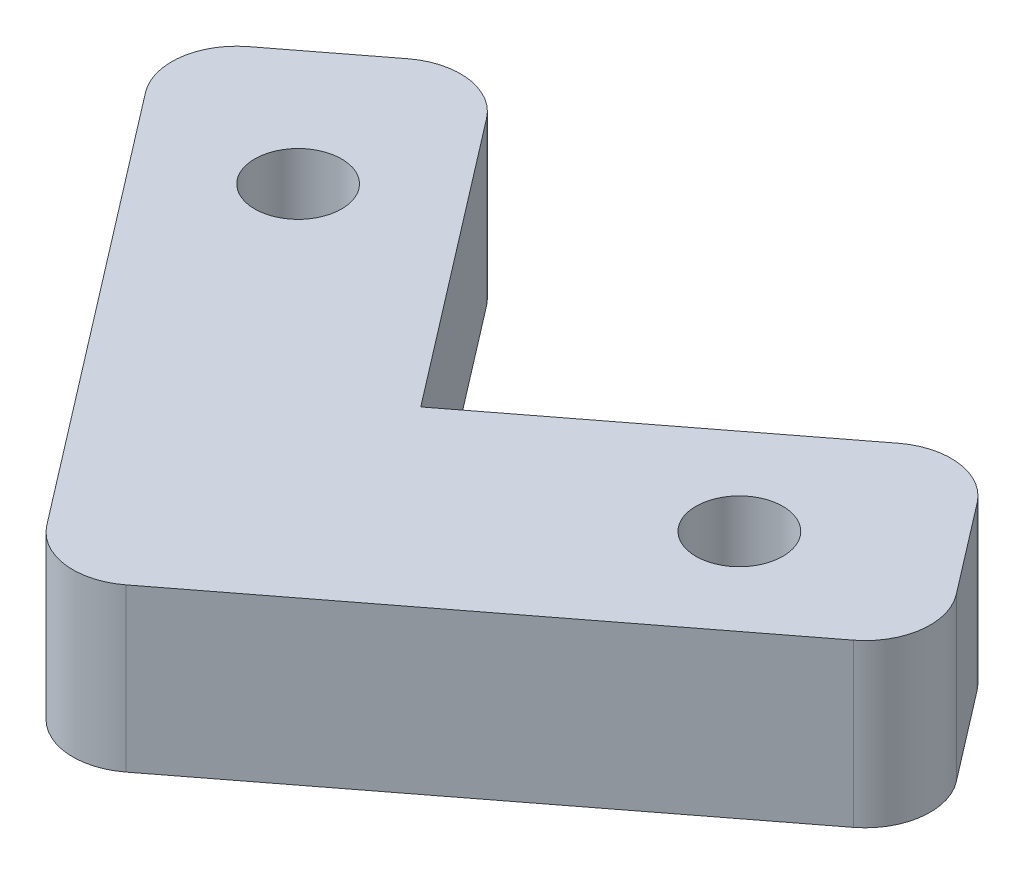
ISO-10303-21;
HEADER;
FILE_DESCRIPTION(('STEP AP214'),'2;1');
FILE_NAME('part.step','',(''),(''),'','','');
FILE_SCHEMA(('AUTOMOTIVE_DESIGN { 1 0 10303 214 1 1 1 1 }'));
ENDSEC;
DATA;
#1=APPLICATION_CONTEXT('core data for automotive mechanical design processes');
#2=APPLICATION_PROTOCOL_DEFINITION('international standard','automotive_design',2000,#1);
#3=PRODUCT_CONTEXT('',#1,'mechanical');
#4=PRODUCT('Part','Part','',(#3));
#5=PRODUCT_RELATED_PRODUCT_CATEGORY('part','',(#4));
#6=PRODUCT_DEFINITION_FORMATION('','',#4);
#7=PRODUCT_DEFINITION_CONTEXT('part definition',#1,'design');
#8=PRODUCT_DEFINITION('design','',#6,#7);
#9=PRODUCT_DEFINITION_SHAPE('','',#8);
#10=(LENGTH_UNIT() NAMED_UNIT(*) SI_UNIT(.MILLI.,.METRE.));
#11=(NAMED_UNIT(*) PLANE_ANGLE_UNIT() SI_UNIT($,.RADIAN.));
#12=(NAMED_UNIT(*) SI_UNIT($,.STERADIAN.) SOLID_ANGLE_UNIT());
#13=UNCERTAINTY_MEASURE_WITH_UNIT(LENGTH_MEASURE(1.E-05),#10,'distance_accuracy_value','');
#14=(GEOMETRIC_REPRESENTATION_CONTEXT(3) GLOBAL_UNCERTAINTY_ASSIGNED_CONTEXT((#13)) GLOBAL_UNIT_ASSIGNED_CONTEXT((#10,
#11,#12)) REPRESENTATION_CONTEXT('',''));
#15=CARTESIAN_POINT('',(0.,0.,0.));
#16=DIRECTION('',(0.,0.,1.));
#17=DIRECTION('',(1.,0.,0.));
#18=AXIS2_PLACEMENT_3D('',#15,#16,#17);
#19=CARTESIAN_POINT('',(0.,6.35,0.));
#20=DIRECTION('',(0.,1.,0.));
#21=DIRECTION('',(0.,0.,1.));
#22=AXIS2_PLACEMENT_3D('',#19,#20,#21);
#23=PLANE('',#22);
#24=CARTESIAN_POINT('',(117.248460029199,6.35,95.9258461633713));
#25=DIRECTION('',(0.,1.,0.));
#26=DIRECTION('',(0.,0.,1.));
#27=AXIS2_PLACEMENT_3D('',#24,#25,#26);
#28=CIRCLE('',#27,1.70053000000001);
#29=CARTESIAN_POINT('',(117.248460029199,6.35,97.6263761633713));
#30=VERTEX_POINT('',#29);
#31=EDGE_CURVE('E214',#30,#30,#28,.T.);
#32=ORIENTED_EDGE('',*,*,#31,.F.);
#33=EDGE_LOOP('',(#32));
#34=FACE_BOUND('',#33,.T.);
#35=DIRECTION('',(-0.608761429008718,0.,-0.793353340291237));
#36=VECTOR('',#35,1.);
#37=CARTESIAN_POINT('',(145.604758319495,6.35,98.9796926758365));
#38=LINE('',#37,#36);
#39=CARTESIAN_POINT('',(144.058504289813,6.35,96.9645751914968));
#40=VERTEX_POINT('',#39);
#41=CARTESIAN_POINT('',(141.352559737869,6.35,93.4381195939021));
#42=VERTEX_POINT('',#41);
#43=EDGE_CURVE('E145',#40,#42,#38,.T.);
#44=ORIENTED_EDGE('',*,*,#43,.T.);
#45=CARTESIAN_POINT('',(139.33744225353,6.35,94.9843736235843));
#46=DIRECTION('',(0.,1.,0.));
#47=DIRECTION('',(0.,0.,1.));
#48=AXIS2_PLACEMENT_3D('',#45,#46,#47);
#49=CIRCLE('',#48,2.54);
#50=CARTESIAN_POINT('',(137.791188223847,6.35,92.9692561392445));
#51=VERTEX_POINT('',#50);
#52=EDGE_CURVE('E124',#42,#51,#49,.T.);
#53=ORIENTED_EDGE('',*,*,#52,.T.);
#54=DIRECTION('',(-0.793353340291261,0.,0.608761429008687));
#55=VECTOR('',#54,1.);
#56=CARTESIAN_POINT('',(139.806305708187,6.35,91.4230021095625));
#57=LINE('',#56,#55);
#58=CARTESIAN_POINT('',(127.211821431064,6.35,101.087089795075));
#59=VERTEX_POINT('',#58);
#60=EDGE_CURVE('E117',#51,#59,#57,.T.);
#61=ORIENTED_EDGE('',*,*,#60,.T.);
#62=DIRECTION('',(-0.608761429008724,0.,-0.793353340291233));
#63=VECTOR('',#62,1.);
#64=CARTESIAN_POINT('',(117.16117023813,6.35,87.9888261468679));
#65=LINE('',#64,#63);
#66=CARTESIAN_POINT('',(118.707424267812,6.35,90.0039436312077));
#67=VERTEX_POINT('',#66);
#68=EDGE_CURVE('E121',#59,#67,#65,.T.);
#69=ORIENTED_EDGE('',*,*,#68,.T.);
#70=CARTESIAN_POINT('',(116.692306783473,6.35,91.5501976608898));
#71=DIRECTION('',(0.,1.,0.));
#72=DIRECTION('',(0.,0.,1.));
#73=AXIS2_PLACEMENT_3D('',#70,#71,#72);
#74=CIRCLE('',#73,2.54);
#75=CARTESIAN_POINT('',(115.14605275379,6.35,89.5350801765501));
#76=VERTEX_POINT('',#75);
#77=EDGE_CURVE('E173',#67,#76,#74,.T.);
#78=ORIENTED_EDGE('',*,*,#77,.T.);
#79=DIRECTION('',(-0.793353340291239,0.,0.608761429008716));
#80=VECTOR('',#79,1.);
#81=CARTESIAN_POINT('',(109.604479671856,6.35,93.787278758176));
#82=LINE('',#81,#80);
#83=CARTESIAN_POINT('',(111.619597156196,6.35,92.2410247284938));
#84=VERTEX_POINT('',#83);
#85=EDGE_CURVE('E138',#76,#84,#82,.T.);
#86=ORIENTED_EDGE('',*,*,#85,.T.);
#87=CARTESIAN_POINT('',(113.165851185878,6.35,94.2561422128336));
#88=DIRECTION('',(0.,1.,0.));
#89=DIRECTION('',(0.,0.,1.));
#90=AXIS2_PLACEMENT_3D('',#87,#88,#89);
#91=CIRCLE('',#90,2.54);
#92=CARTESIAN_POINT('',(111.150733701538,6.35,95.8023962425157));
#93=VERTEX_POINT('',#92);
#94=EDGE_CURVE('E169',#84,#93,#91,.T.);
#95=ORIENTED_EDGE('',*,*,#94,.T.);
#96=DIRECTION('',(0.608761429008717,0.,0.793353340291238));
#97=VECTOR('',#96,1.);
#98=CARTESIAN_POINT('',(125.453583476098,6.35,114.442232972658));
#99=LINE('',#98,#97);
#100=CARTESIAN_POINT('',(123.907329446416,6.35,112.427115488318));
#101=VERTEX_POINT('',#100);
#102=EDGE_CURVE('E190',#93,#101,#99,.T.);
#103=ORIENTED_EDGE('',*,*,#102,.T.);
#104=CARTESIAN_POINT('',(125.922446930755,6.35,110.880861458636));
#105=DIRECTION('',(0.,1.,0.));
#106=DIRECTION('',(0.,0.,1.));
#107=AXIS2_PLACEMENT_3D('',#104,#105,#106);
#108=CIRCLE('',#107,2.54);
#109=CARTESIAN_POINT('',(127.468700960438,6.35,112.895978942976));
#110=VERTEX_POINT('',#109);
#111=EDGE_CURVE('E55',#101,#110,#108,.T.);
#112=ORIENTED_EDGE('',*,*,#111,.T.);
#113=DIRECTION('',(0.793353340291238,0.,-0.608761429008717));
#114=VECTOR('',#113,1.);
#115=CARTESIAN_POINT('',(125.453583476098,6.35,114.442232972658));
#116=LINE('',#115,#114);
#117=CARTESIAN_POINT('',(143.589640835155,6.35,100.525946705519));
#118=VERTEX_POINT('',#117);
#119=EDGE_CURVE('E149',#110,#118,#116,.T.);
#120=ORIENTED_EDGE('',*,*,#119,.T.);
#121=CARTESIAN_POINT('',(142.043386805473,6.35,98.5108292211789));
#122=DIRECTION('',(0.,1.,0.));
#123=DIRECTION('',(0.,0.,1.));
#124=AXIS2_PLACEMENT_3D('',#121,#122,#123);
#125=CIRCLE('',#124,2.54);
#126=EDGE_CURVE('E171',#118,#40,#125,.T.);
#127=ORIENTED_EDGE('',*,*,#126,.T.);
#128=EDGE_LOOP('',(#44,#53,#61,#69,#78,#86,#95,#103,#112,#120,#127));
#129=FACE_BOUND('',#128,.T.);
#130=CARTESIAN_POINT('',(137.667738302992,6.35,99.0669824669048));
#131=DIRECTION('',(0.,1.,0.));
#132=DIRECTION('',(0.,0.,1.));
#133=AXIS2_PLACEMENT_3D('',#130,#131,#132);
#134=CIRCLE('',#133,1.70052999999999);
#135=CARTESIAN_POINT('',(137.667738302992,6.35,100.767512466905));
#136=VERTEX_POINT('',#135);
#137=EDGE_CURVE('E221',#136,#136,#134,.T.);
#138=ORIENTED_EDGE('',*,*,#137,.F.);
#139=EDGE_LOOP('',(#138));
#140=FACE_BOUND('',#139,.T.);
#141=ADVANCED_FACE('F33',(#34,#129,#140),#23,.T.);
#142=CARTESIAN_POINT('',(0.,0.,0.));
#143=DIRECTION('',(0.,1.,0.));
#144=DIRECTION('',(0.,0.,1.));
#145=AXIS2_PLACEMENT_3D('',#142,#143,#144);
#146=PLANE('',#145);
#147=CARTESIAN_POINT('',(117.248460029199,0.,95.9258461633713));
#148=DIRECTION('',(0.,1.,0.));
#149=DIRECTION('',(0.,0.,1.));
#150=AXIS2_PLACEMENT_3D('',#147,#148,#149);
#151=CIRCLE('',#150,1.70053000000001);
#152=CARTESIAN_POINT('',(117.248460029199,0.,97.6263761633713));
#153=VERTEX_POINT('',#152);
#154=EDGE_CURVE('E218',#153,#153,#151,.T.);
#155=ORIENTED_EDGE('',*,*,#154,.T.);
#156=EDGE_LOOP('',(#155));
#157=FACE_BOUND('',#156,.T.);
#158=DIRECTION('',(-0.793353340291261,0.,0.608761429008687));
#159=VECTOR('',#158,1.);
#160=CARTESIAN_POINT('',(139.806305708187,0.,91.4230021095625));
#161=LINE('',#160,#159);
#162=CARTESIAN_POINT('',(137.791188223847,0.,92.9692561392445));
#163=VERTEX_POINT('',#162);
#164=CARTESIAN_POINT('',(127.211821431064,0.,101.087089795075));
#165=VERTEX_POINT('',#164);
#166=EDGE_CURVE('E142',#163,#165,#161,.T.);
#167=ORIENTED_EDGE('',*,*,#166,.F.);
#168=CARTESIAN_POINT('',(139.33744225353,0.,94.9843736235843));
#169=DIRECTION('',(0.,1.,0.));
#170=DIRECTION('',(0.,0.,1.));
#171=AXIS2_PLACEMENT_3D('',#168,#169,#170);
#172=CIRCLE('',#171,2.54);
#173=CARTESIAN_POINT('',(141.352559737869,0.,93.4381195939021));
#174=VERTEX_POINT('',#173);
#175=EDGE_CURVE('E161',#163,#174,#172,.F.);
#176=ORIENTED_EDGE('',*,*,#175,.T.);
#177=DIRECTION('',(-0.608761429008718,0.,-0.793353340291237));
#178=VECTOR('',#177,1.);
#179=CARTESIAN_POINT('',(145.604758319495,0.,98.9796926758365));
#180=LINE('',#179,#178);
#181=CARTESIAN_POINT('',(144.058504289813,0.,96.9645751914968));
#182=VERTEX_POINT('',#181);
#183=EDGE_CURVE('E129',#182,#174,#180,.T.);
#184=ORIENTED_EDGE('',*,*,#183,.F.);
#185=CARTESIAN_POINT('',(142.043386805473,0.,98.5108292211789));
#186=DIRECTION('',(0.,1.,0.));
#187=DIRECTION('',(0.,0.,1.));
#188=AXIS2_PLACEMENT_3D('',#185,#186,#187);
#189=CIRCLE('',#188,2.54);
#190=CARTESIAN_POINT('',(143.589640835155,0.,100.525946705519));
#191=VERTEX_POINT('',#190);
#192=EDGE_CURVE('E157',#182,#191,#189,.F.);
#193=ORIENTED_EDGE('',*,*,#192,.T.);
#194=DIRECTION('',(0.793353340291238,0.,-0.608761429008717));
#195=VECTOR('',#194,1.);
#196=CARTESIAN_POINT('',(125.453583476098,0.,114.442232972658));
#197=LINE('',#196,#195);
#198=CARTESIAN_POINT('',(127.468700960438,0.,112.895978942976));
#199=VERTEX_POINT('',#198);
#200=EDGE_CURVE('E201',#199,#191,#197,.T.);
#201=ORIENTED_EDGE('',*,*,#200,.F.);
#202=CARTESIAN_POINT('',(125.922446930755,0.,110.880861458636));
#203=DIRECTION('',(0.,1.,0.));
#204=DIRECTION('',(0.,0.,1.));
#205=AXIS2_PLACEMENT_3D('',#202,#203,#204);
#206=CIRCLE('',#205,2.54);
#207=CARTESIAN_POINT('',(123.907329446416,0.,112.427115488318));
#208=VERTEX_POINT('',#207);
#209=EDGE_CURVE('E147',#199,#208,#206,.F.);
#210=ORIENTED_EDGE('',*,*,#209,.T.);
#211=DIRECTION('',(0.608761429008717,0.,0.793353340291238));
#212=VECTOR('',#211,1.);
#213=CARTESIAN_POINT('',(125.453583476098,0.,114.442232972658));
#214=LINE('',#213,#212);
#215=CARTESIAN_POINT('',(111.150733701538,0.,95.8023962425157));
#216=VERTEX_POINT('',#215);
#217=EDGE_CURVE('E193',#216,#208,#214,.T.);
#218=ORIENTED_EDGE('',*,*,#217,.F.);
#219=CARTESIAN_POINT('',(113.165851185878,0.,94.2561422128336));
#220=DIRECTION('',(0.,1.,0.));
#221=DIRECTION('',(0.,0.,1.));
#222=AXIS2_PLACEMENT_3D('',#219,#220,#221);
#223=CIRCLE('',#222,2.54);
#224=CARTESIAN_POINT('',(111.619597156196,0.,92.2410247284938));
#225=VERTEX_POINT('',#224);
#226=EDGE_CURVE('E155',#216,#225,#223,.F.);
#227=ORIENTED_EDGE('',*,*,#226,.T.);
#228=DIRECTION('',(-0.793353340291239,0.,0.608761429008716));
#229=VECTOR('',#228,1.);
#230=CARTESIAN_POINT('',(109.604479671856,0.,93.787278758176));
#231=LINE('',#230,#229);
#232=CARTESIAN_POINT('',(115.14605275379,0.,89.5350801765501));
#233=VERTEX_POINT('',#232);
#234=EDGE_CURVE('E207',#233,#225,#231,.T.);
#235=ORIENTED_EDGE('',*,*,#234,.F.);
#236=CARTESIAN_POINT('',(116.692306783473,0.,91.5501976608898));
#237=DIRECTION('',(0.,1.,0.));
#238=DIRECTION('',(0.,0.,1.));
#239=AXIS2_PLACEMENT_3D('',#236,#237,#238);
#240=CIRCLE('',#239,2.54);
#241=CARTESIAN_POINT('',(118.707424267812,0.,90.0039436312077));
#242=VERTEX_POINT('',#241);
#243=EDGE_CURVE('E159',#233,#242,#240,.F.);
#244=ORIENTED_EDGE('',*,*,#243,.T.);
#245=DIRECTION('',(-0.608761429008724,0.,-0.793353340291233));
#246=VECTOR('',#245,1.);
#247=CARTESIAN_POINT('',(117.16117023813,0.,87.9888261468679));
#248=LINE('',#247,#246);
#249=EDGE_CURVE('E212',#165,#242,#248,.T.);
#250=ORIENTED_EDGE('',*,*,#249,.F.);
#251=EDGE_LOOP('',(#167,#176,#184,#193,#201,#210,#218,#227,#235,#244,#250));
#252=FACE_BOUND('',#251,.T.);
#253=CARTESIAN_POINT('',(137.667738302992,0.,99.0669824669048));
#254=DIRECTION('',(0.,1.,0.));
#255=DIRECTION('',(0.,0.,1.));
#256=AXIS2_PLACEMENT_3D('',#253,#254,#255);
#257=CIRCLE('',#256,1.70052999999999);
#258=CARTESIAN_POINT('',(137.667738302992,0.,100.767512466905));
#259=VERTEX_POINT('',#258);
#260=EDGE_CURVE('E224',#259,#259,#257,.T.);
#261=ORIENTED_EDGE('',*,*,#260,.T.);
#262=EDGE_LOOP('',(#261));
#263=FACE_BOUND('',#262,.T.);
#264=ADVANCED_FACE('F203',(#157,#252,#263),#146,.F.);
#265=CARTESIAN_POINT('',(139.806305708187,6.35,91.4230021095625));
#266=DIRECTION('',(0.608761429008687,0.,0.793353340291261));
#267=DIRECTION('',(0.793353340291261,0.,-0.608761429008687));
#268=AXIS2_PLACEMENT_3D('',#265,#266,#267);
#269=PLANE('',#268);
#270=ORIENTED_EDGE('',*,*,#60,.F.);
#271=DIRECTION('',(0.,-1.,0.));
#272=VECTOR('',#271,1.);
#273=CARTESIAN_POINT('',(137.791188223847,6.35,92.9692561392445));
#274=LINE('',#273,#272);
#275=EDGE_CURVE('E144',#51,#163,#274,.T.);
#276=ORIENTED_EDGE('',*,*,#275,.T.);
#277=ORIENTED_EDGE('',*,*,#166,.T.);
#278=DIRECTION('',(0.,-1.,0.));
#279=VECTOR('',#278,1.);
#280=CARTESIAN_POINT('',(127.211821431064,6.35,101.087089795075));
#281=LINE('',#280,#279);
#282=EDGE_CURVE('E135',#59,#165,#281,.T.);
#283=ORIENTED_EDGE('',*,*,#282,.F.);
#284=EDGE_LOOP('',(#270,#276,#277,#283));
#285=FACE_BOUND('',#284,.T.);
#286=ADVANCED_FACE('F140',(#285),#269,.F.);
#287=CARTESIAN_POINT('',(117.16117023813,6.35,87.9888261468679));
#288=DIRECTION('',(-0.793353340291233,0.,0.608761429008724));
#289=DIRECTION('',(0.608761429008724,0.,0.793353340291233));
#290=AXIS2_PLACEMENT_3D('',#287,#288,#289);
#291=PLANE('',#290);
#292=ORIENTED_EDGE('',*,*,#249,.T.);
#293=DIRECTION('',(0.,-1.,0.));
#294=VECTOR('',#293,1.);
#295=CARTESIAN_POINT('',(118.707424267812,6.35,90.0039436312077));
#296=LINE('',#295,#294);
#297=EDGE_CURVE('E137',#242,#67,#296,.F.);
#298=ORIENTED_EDGE('',*,*,#297,.T.);
#299=ORIENTED_EDGE('',*,*,#68,.F.);
#300=ORIENTED_EDGE('',*,*,#282,.T.);
#301=EDGE_LOOP('',(#292,#298,#299,#300));
#302=FACE_BOUND('',#301,.T.);
#303=ADVANCED_FACE('F134',(#302),#291,.F.);
#304=CARTESIAN_POINT('',(109.604479671856,6.35,93.787278758176));
#305=DIRECTION('',(0.608761429008716,0.,0.793353340291239));
#306=DIRECTION('',(0.793353340291239,0.,-0.608761429008716));
#307=AXIS2_PLACEMENT_3D('',#304,#305,#306);
#308=PLANE('',#307);
#309=ORIENTED_EDGE('',*,*,#85,.F.);
#310=DIRECTION('',(0.,-1.,0.));
#311=VECTOR('',#310,1.);
#312=CARTESIAN_POINT('',(115.14605275379,6.35,89.5350801765501));
#313=LINE('',#312,#311);
#314=EDGE_CURVE('E178',#76,#233,#313,.T.);
#315=ORIENTED_EDGE('',*,*,#314,.T.);
#316=ORIENTED_EDGE('',*,*,#234,.T.);
#317=DIRECTION('',(0.,-1.,0.));
#318=VECTOR('',#317,1.);
#319=CARTESIAN_POINT('',(111.619597156196,6.35,92.2410247284938));
#320=LINE('',#319,#318);
#321=EDGE_CURVE('E176',#225,#84,#320,.F.);
#322=ORIENTED_EDGE('',*,*,#321,.T.);
#323=EDGE_LOOP('',(#309,#315,#316,#322));
#324=FACE_BOUND('',#323,.T.);
#325=ADVANCED_FACE('F253',(#324),#308,.F.);
#326=CARTESIAN_POINT('',(125.453583476098,6.35,114.442232972658));
#327=DIRECTION('',(0.793353340291238,0.,-0.608761429008717));
#328=DIRECTION('',(-0.608761429008717,0.,-0.793353340291238));
#329=AXIS2_PLACEMENT_3D('',#326,#327,#328);
#330=PLANE('',#329);
#331=ORIENTED_EDGE('',*,*,#102,.F.);
#332=DIRECTION('',(0.,-1.,0.));
#333=VECTOR('',#332,1.);
#334=CARTESIAN_POINT('',(111.150733701538,6.35,95.8023962425157));
#335=LINE('',#334,#333);
#336=EDGE_CURVE('E11',#93,#216,#335,.T.);
#337=ORIENTED_EDGE('',*,*,#336,.T.);
#338=ORIENTED_EDGE('',*,*,#217,.T.);
#339=DIRECTION('',(0.,-1.,0.));
#340=VECTOR('',#339,1.);
#341=CARTESIAN_POINT('',(123.907329446416,6.35,112.427115488318));
#342=LINE('',#341,#340);
#343=EDGE_CURVE('E41',#208,#101,#342,.F.);
#344=ORIENTED_EDGE('',*,*,#343,.T.);
#345=EDGE_LOOP('',(#331,#337,#338,#344));
#346=FACE_BOUND('',#345,.T.);
#347=ADVANCED_FACE('F189',(#346),#330,.F.);
#348=CARTESIAN_POINT('',(125.453583476098,6.35,114.442232972658));
#349=DIRECTION('',(-0.608761429008717,0.,-0.793353340291238));
#350=DIRECTION('',(-0.793353340291238,0.,0.608761429008717));
#351=AXIS2_PLACEMENT_3D('',#348,#349,#350);
#352=PLANE('',#351);
#353=ORIENTED_EDGE('',*,*,#200,.T.);
#354=DIRECTION('',(0.,-1.,0.));
#355=VECTOR('',#354,1.);
#356=CARTESIAN_POINT('',(143.589640835155,6.35,100.525946705519));
#357=LINE('',#356,#355);
#358=EDGE_CURVE('E48',#191,#118,#357,.F.);
#359=ORIENTED_EDGE('',*,*,#358,.T.);
#360=ORIENTED_EDGE('',*,*,#119,.F.);
#361=DIRECTION('',(0.,-1.,0.));
#362=VECTOR('',#361,1.);
#363=CARTESIAN_POINT('',(127.468700960438,6.35,112.895978942976));
#364=LINE('',#363,#362);
#365=EDGE_CURVE('E182',#110,#199,#364,.T.);
#366=ORIENTED_EDGE('',*,*,#365,.T.);
#367=EDGE_LOOP('',(#353,#359,#360,#366));
#368=FACE_BOUND('',#367,.T.);
#369=ADVANCED_FACE('F200',(#368),#352,.F.);
#370=CARTESIAN_POINT('',(145.604758319495,6.35,98.9796926758365));
#371=DIRECTION('',(-0.793353340291237,0.,0.608761429008718));
#372=DIRECTION('',(0.608761429008718,0.,0.793353340291237));
#373=AXIS2_PLACEMENT_3D('',#370,#371,#372);
#374=PLANE('',#373);
#375=ORIENTED_EDGE('',*,*,#183,.T.);
#376=DIRECTION('',(0.,-1.,0.));
#377=VECTOR('',#376,1.);
#378=CARTESIAN_POINT('',(141.352559737869,6.35,93.4381195939021));
#379=LINE('',#378,#377);
#380=EDGE_CURVE('E166',#174,#42,#379,.F.);
#381=ORIENTED_EDGE('',*,*,#380,.T.);
#382=ORIENTED_EDGE('',*,*,#43,.F.);
#383=DIRECTION('',(0.,-1.,0.));
#384=VECTOR('',#383,1.);
#385=CARTESIAN_POINT('',(144.058504289813,6.35,96.9645751914968));
#386=LINE('',#385,#384);
#387=EDGE_CURVE('E163',#40,#182,#386,.T.);
#388=ORIENTED_EDGE('',*,*,#387,.T.);
#389=EDGE_LOOP('',(#375,#381,#382,#388));
#390=FACE_BOUND('',#389,.T.);
#391=ADVANCED_FACE('F245',(#390),#374,.F.);
#392=CARTESIAN_POINT('',(117.248460029199,6.35,95.9258461633713));
#393=DIRECTION('',(0.,-1.,0.));
#394=DIRECTION('',(0.,0.,-1.));
#395=AXIS2_PLACEMENT_3D('',#392,#393,#394);
#396=CYLINDRICAL_SURFACE('',#395,1.70053000000001);
#397=ORIENTED_EDGE('',*,*,#31,.T.);
#398=EDGE_LOOP('',(#397));
#399=FACE_BOUND('',#398,.T.);
#400=ORIENTED_EDGE('',*,*,#154,.F.);
#401=EDGE_LOOP('',(#400));
#402=FACE_BOUND('',#401,.T.);
#403=ADVANCED_FACE('F242',(#399,#402),#396,.F.);
#404=CARTESIAN_POINT('',(137.667738302992,6.35,99.0669824669048));
#405=DIRECTION('',(0.,-1.,0.));
#406=DIRECTION('',(0.,0.,-1.));
#407=AXIS2_PLACEMENT_3D('',#404,#405,#406);
#408=CYLINDRICAL_SURFACE('',#407,1.70052999999999);
#409=ORIENTED_EDGE('',*,*,#137,.T.);
#410=EDGE_LOOP('',(#409));
#411=FACE_BOUND('',#410,.T.);
#412=ORIENTED_EDGE('',*,*,#260,.F.);
#413=EDGE_LOOP('',(#412));
#414=FACE_BOUND('',#413,.T.);
#415=ADVANCED_FACE('F230',(#411,#414),#408,.F.);
#416=CARTESIAN_POINT('',(139.33744225353,6.35,94.9843736235843));
#417=DIRECTION('',(0.,-1.,0.));
#418=DIRECTION('',(0.,0.,-1.));
#419=AXIS2_PLACEMENT_3D('',#416,#417,#418);
#420=CYLINDRICAL_SURFACE('',#419,2.54);
#421=ORIENTED_EDGE('',*,*,#52,.F.);
#422=ORIENTED_EDGE('',*,*,#380,.F.);
#423=ORIENTED_EDGE('',*,*,#175,.F.);
#424=ORIENTED_EDGE('',*,*,#275,.F.);
#425=EDGE_LOOP('',(#421,#422,#423,#424));
#426=FACE_BOUND('',#425,.T.);
#427=ADVANCED_FACE('F261',(#426),#420,.T.);
#428=CARTESIAN_POINT('',(116.692306783473,6.35,91.5501976608898));
#429=DIRECTION('',(0.,-1.,0.));
#430=DIRECTION('',(0.,0.,-1.));
#431=AXIS2_PLACEMENT_3D('',#428,#429,#430);
#432=CYLINDRICAL_SURFACE('',#431,2.54);
#433=ORIENTED_EDGE('',*,*,#77,.F.);
#434=ORIENTED_EDGE('',*,*,#297,.F.);
#435=ORIENTED_EDGE('',*,*,#243,.F.);
#436=ORIENTED_EDGE('',*,*,#314,.F.);
#437=EDGE_LOOP('',(#433,#434,#435,#436));
#438=FACE_BOUND('',#437,.T.);
#439=ADVANCED_FACE('F264',(#438),#432,.T.);
#440=CARTESIAN_POINT('',(142.043386805473,6.35,98.5108292211789));
#441=DIRECTION('',(0.,-1.,0.));
#442=DIRECTION('',(0.,0.,-1.));
#443=AXIS2_PLACEMENT_3D('',#440,#441,#442);
#444=CYLINDRICAL_SURFACE('',#443,2.54);
#445=ORIENTED_EDGE('',*,*,#126,.F.);
#446=ORIENTED_EDGE('',*,*,#358,.F.);
#447=ORIENTED_EDGE('',*,*,#192,.F.);
#448=ORIENTED_EDGE('',*,*,#387,.F.);
#449=EDGE_LOOP('',(#445,#446,#447,#448));
#450=FACE_BOUND('',#449,.T.);
#451=ADVANCED_FACE('F268',(#450),#444,.T.);
#452=CARTESIAN_POINT('',(113.165851185878,6.35,94.2561422128336));
#453=DIRECTION('',(0.,-1.,0.));
#454=DIRECTION('',(0.,0.,-1.));
#455=AXIS2_PLACEMENT_3D('',#452,#453,#454);
#456=CYLINDRICAL_SURFACE('',#455,2.54);
#457=ORIENTED_EDGE('',*,*,#94,.F.);
#458=ORIENTED_EDGE('',*,*,#321,.F.);
#459=ORIENTED_EDGE('',*,*,#226,.F.);
#460=ORIENTED_EDGE('',*,*,#336,.F.);
#461=EDGE_LOOP('',(#457,#458,#459,#460));
#462=FACE_BOUND('',#461,.T.);
#463=ADVANCED_FACE('F271',(#462),#456,.T.);
#464=CARTESIAN_POINT('',(125.922446930755,6.35,110.880861458636));
#465=DIRECTION('',(0.,-1.,0.));
#466=DIRECTION('',(0.,0.,-1.));
#467=AXIS2_PLACEMENT_3D('',#464,#465,#466);
#468=CYLINDRICAL_SURFACE('',#467,2.54);
#469=ORIENTED_EDGE('',*,*,#111,.F.);
#470=ORIENTED_EDGE('',*,*,#343,.F.);
#471=ORIENTED_EDGE('',*,*,#209,.F.);
#472=ORIENTED_EDGE('',*,*,#365,.F.);
#473=EDGE_LOOP('',(#469,#470,#471,#472));
#474=FACE_BOUND('',#473,.T.);
#475=ADVANCED_FACE('F35',(#474),#468,.T.);
#476=CLOSED_SHELL('',(#141,#264,#286,#303,#325,#347,#369,#391,#403,#415,#427,#439,#451,#463,#475));
#477=MANIFOLD_SOLID_BREP('B2',#476);
#478=ADVANCED_BREP_SHAPE_REPRESENTATION('',(#18,#477),#14);
#479=SHAPE_DEFINITION_REPRESENTATION(#9,#478);
ENDSEC;
END-ISO-10303-21;
